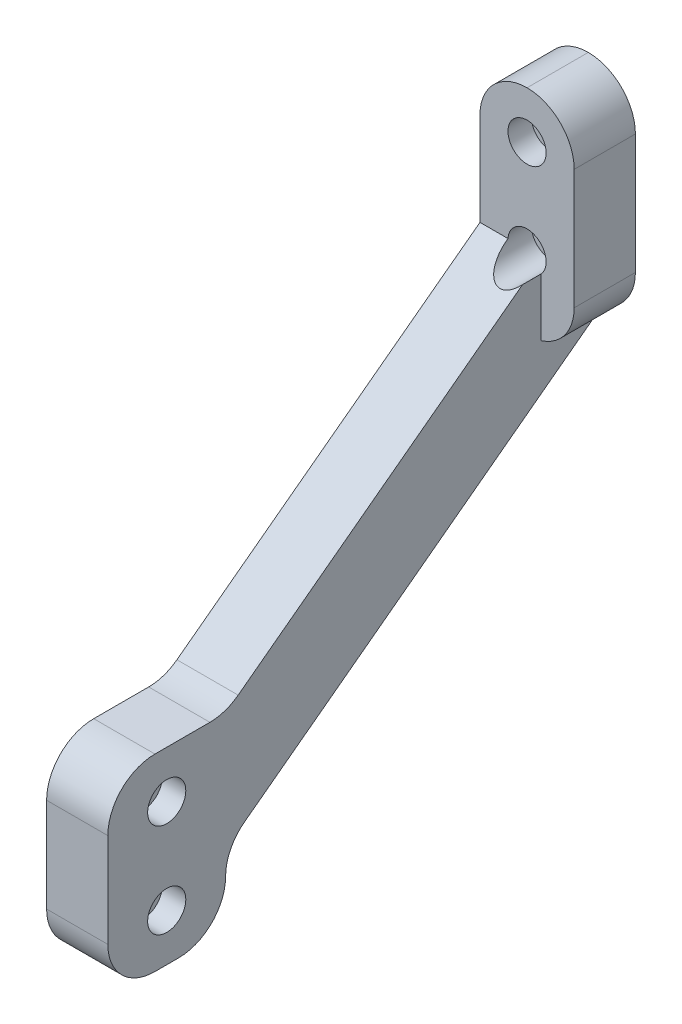
ISO-10303-21;
HEADER;
FILE_DESCRIPTION(('STEP AP214'),'2;1');
FILE_NAME('part.step','',(''),(''),'','','');
FILE_SCHEMA(('AUTOMOTIVE_DESIGN { 1 0 10303 214 1 1 1 1 }'));
ENDSEC;
DATA;
#1=APPLICATION_CONTEXT('core data for automotive mechanical design processes');
#2=APPLICATION_PROTOCOL_DEFINITION('international standard','automotive_design',2000,#1);
#3=PRODUCT_CONTEXT('',#1,'mechanical');
#4=PRODUCT('Part','Part','',(#3));
#5=PRODUCT_RELATED_PRODUCT_CATEGORY('part','',(#4));
#6=PRODUCT_DEFINITION_FORMATION('','',#4);
#7=PRODUCT_DEFINITION_CONTEXT('part definition',#1,'design');
#8=PRODUCT_DEFINITION('design','',#6,#7);
#9=PRODUCT_DEFINITION_SHAPE('','',#8);
#10=(LENGTH_UNIT() NAMED_UNIT(*) SI_UNIT(.MILLI.,.METRE.));
#11=(NAMED_UNIT(*) PLANE_ANGLE_UNIT() SI_UNIT($,.RADIAN.));
#12=(NAMED_UNIT(*) SI_UNIT($,.STERADIAN.) SOLID_ANGLE_UNIT());
#13=UNCERTAINTY_MEASURE_WITH_UNIT(LENGTH_MEASURE(1.E-05),#10,'distance_accuracy_value','');
#14=(GEOMETRIC_REPRESENTATION_CONTEXT(3) GLOBAL_UNCERTAINTY_ASSIGNED_CONTEXT((#13)) GLOBAL_UNIT_ASSIGNED_CONTEXT((#10,
#11,#12)) REPRESENTATION_CONTEXT('',''));
#15=CARTESIAN_POINT('',(0.,0.,0.));
#16=DIRECTION('',(0.,0.,1.));
#17=DIRECTION('',(1.,0.,0.));
#18=AXIS2_PLACEMENT_3D('',#15,#16,#17);
#19=CARTESIAN_POINT('',(0.,10.,-12.5));
#20=DIRECTION('',(1.,0.,0.));
#21=DIRECTION('',(0.,0.,-1.));
#22=AXIS2_PLACEMENT_3D('',#19,#20,#21);
#23=CYLINDRICAL_SURFACE('',#22,2.125);
#24=CARTESIAN_POINT('',(0.,10.,-12.5));
#25=DIRECTION('',(1.,0.,0.));
#26=DIRECTION('',(0.,0.,-1.));
#27=AXIS2_PLACEMENT_3D('',#24,#25,#26);
#28=CIRCLE('',#27,2.125);
#29=CARTESIAN_POINT('',(0.,10.,-14.625));
#30=VERTEX_POINT('',#29);
#31=EDGE_CURVE('E244',#30,#30,#28,.T.);
#32=CARTESIAN_POINT('',(8.,10.,-12.5));
#33=DIRECTION('',(1.,0.,0.));
#34=DIRECTION('',(0.,0.,-1.));
#35=AXIS2_PLACEMENT_3D('',#32,#33,#34);
#36=CIRCLE('',#35,2.125);
#37=CARTESIAN_POINT('',(8.,10.,-14.625));
#38=VERTEX_POINT('',#37);
#39=EDGE_CURVE('E239',#38,#38,#36,.F.);
#40=CARTESIAN_POINT('',(0.,10.,-14.625));
#41=CARTESIAN_POINT('',(0.0833333333333335,10.,-14.625));
#42=CARTESIAN_POINT('',(0.166666666666667,10.,-14.625));
#43=CARTESIAN_POINT('',(0.333333333333333,10.,-14.625));
#44=CARTESIAN_POINT('',(0.416666666666667,10.,-14.625));
#45=CARTESIAN_POINT('',(0.583333333333333,10.,-14.625));
#46=CARTESIAN_POINT('',(0.666666666666667,10.,-14.625));
#47=CARTESIAN_POINT('',(0.833333333333333,10.,-14.625));
#48=CARTESIAN_POINT('',(0.916666666666667,10.,-14.625));
#49=CARTESIAN_POINT('',(1.08333333333333,10.,-14.625));
#50=CARTESIAN_POINT('',(1.16666666666667,10.,-14.625));
#51=CARTESIAN_POINT('',(1.33333333333333,10.,-14.625));
#52=CARTESIAN_POINT('',(1.41666666666667,10.,-14.625));
#53=CARTESIAN_POINT('',(1.58333333333333,10.,-14.625));
#54=CARTESIAN_POINT('',(1.66666666666667,10.,-14.625));
#55=CARTESIAN_POINT('',(1.83333333333333,10.,-14.625));
#56=CARTESIAN_POINT('',(1.91666666666667,10.,-14.625));
#57=CARTESIAN_POINT('',(2.08333333333333,10.,-14.625));
#58=CARTESIAN_POINT('',(2.16666666666667,10.,-14.625));
#59=CARTESIAN_POINT('',(2.33333333333333,10.,-14.625));
#60=CARTESIAN_POINT('',(2.41666666666667,10.,-14.625));
#61=CARTESIAN_POINT('',(2.58333333333333,10.,-14.625));
#62=CARTESIAN_POINT('',(2.66666666666667,10.,-14.625));
#63=CARTESIAN_POINT('',(2.83333333333333,10.,-14.625));
#64=CARTESIAN_POINT('',(2.91666666666667,10.,-14.625));
#65=CARTESIAN_POINT('',(3.08333333333333,10.,-14.625));
#66=CARTESIAN_POINT('',(3.16666666666667,10.,-14.625));
#67=CARTESIAN_POINT('',(3.33333333333333,10.,-14.625));
#68=CARTESIAN_POINT('',(3.41666666666667,10.,-14.625));
#69=CARTESIAN_POINT('',(3.58333333333333,10.,-14.625));
#70=CARTESIAN_POINT('',(3.66666666666667,10.,-14.625));
#71=CARTESIAN_POINT('',(3.83333333333333,10.,-14.625));
#72=CARTESIAN_POINT('',(3.91666666666667,10.,-14.625));
#73=CARTESIAN_POINT('',(4.08333333333333,10.,-14.625));
#74=CARTESIAN_POINT('',(4.16666666666667,10.,-14.625));
#75=CARTESIAN_POINT('',(4.33333333333333,10.,-14.625));
#76=CARTESIAN_POINT('',(4.41666666666667,10.,-14.625));
#77=CARTESIAN_POINT('',(4.58333333333333,10.,-14.625));
#78=CARTESIAN_POINT('',(4.66666666666667,10.,-14.625));
#79=CARTESIAN_POINT('',(4.83333333333333,10.,-14.625));
#80=CARTESIAN_POINT('',(4.91666666666667,10.,-14.625));
#81=CARTESIAN_POINT('',(5.08333333333333,10.,-14.625));
#82=CARTESIAN_POINT('',(5.16666666666667,10.,-14.625));
#83=CARTESIAN_POINT('',(5.33333333333333,10.,-14.625));
#84=CARTESIAN_POINT('',(5.41666666666667,10.,-14.625));
#85=CARTESIAN_POINT('',(5.58333333333333,10.,-14.625));
#86=CARTESIAN_POINT('',(5.66666666666667,10.,-14.625));
#87=CARTESIAN_POINT('',(5.83333333333333,10.,-14.625));
#88=CARTESIAN_POINT('',(5.91666666666667,10.,-14.625));
#89=CARTESIAN_POINT('',(6.08333333333333,10.,-14.625));
#90=CARTESIAN_POINT('',(6.16666666666667,10.,-14.625));
#91=CARTESIAN_POINT('',(6.33333333333333,10.,-14.625));
#92=CARTESIAN_POINT('',(6.41666666666667,10.,-14.625));
#93=CARTESIAN_POINT('',(6.58333333333333,10.,-14.625));
#94=CARTESIAN_POINT('',(6.66666666666667,10.,-14.625));
#95=CARTESIAN_POINT('',(6.83333333333333,10.,-14.625));
#96=CARTESIAN_POINT('',(6.91666666666667,10.,-14.625));
#97=CARTESIAN_POINT('',(7.08333333333333,10.,-14.625));
#98=CARTESIAN_POINT('',(7.16666666666667,10.,-14.625));
#99=CARTESIAN_POINT('',(7.33333333333333,10.,-14.625));
#100=CARTESIAN_POINT('',(7.41666666666667,10.,-14.625));
#101=CARTESIAN_POINT('',(7.58333333333333,10.,-14.625));
#102=CARTESIAN_POINT('',(7.66666666666667,10.,-14.625));
#103=CARTESIAN_POINT('',(7.83333333333333,10.,-14.625));
#104=CARTESIAN_POINT('',(7.91666666666667,10.,-14.625));
#105=CARTESIAN_POINT('',(8.,10.,-14.625));
#106=B_SPLINE_CURVE_WITH_KNOTS('',3,(#40,#41,#42,#43,#44,#45,#46,#47,#48,#49,#50,#51,#52,#53,
#54,#55,#56,#57,#58,#59,#60,#61,#62,#63,#64,#65,#66,#67,#68,#69,#70,#71,#72,#73,#74,#75,#76,#77,
#78,#79,#80,#81,#82,#83,#84,#85,#86,#87,#88,#89,#90,#91,#92,#93,#94,#95,#96,#97,#98,#99,#100,
#101,#102,#103,#104,#105),.UNSPECIFIED.,.F.,.F.,(4,2,2,2,2,2,2,2,2,2,2,2,2,2,2,2,2,2,2,2,2,2,2,
2,2,2,2,2,2,2,2,2,4),(0.,0.25,0.5,0.75,1.,1.25,1.5,1.75,2.,2.25,2.5,2.75,3.,3.25,3.5,3.75,4.,
4.25,4.5,4.75,5.,5.25,5.5,5.75,6.,6.25,6.5,6.75,7.,7.25,7.5,7.75,8.),.UNSPECIFIED.);
#107=EDGE_CURVE('BSEAM41',#30,#38,#106,.T.);
#108=ORIENTED_EDGE('',*,*,#31,.F.);
#109=ORIENTED_EDGE('',*,*,#39,.F.);
#110=ORIENTED_EDGE('',*,*,#107,.T.);
#111=ORIENTED_EDGE('',*,*,#107,.F.);
#112=EDGE_LOOP('',(#108,#110,#109,#111));
#113=FACE_BOUND('',#112,.T.);
#114=ADVANCED_FACE('F41',(#113),#23,.F.);
#115=CARTESIAN_POINT('',(0.,30.,-12.5));
#116=DIRECTION('',(1.,0.,0.));
#117=DIRECTION('',(0.,0.,-1.));
#118=AXIS2_PLACEMENT_3D('',#115,#116,#117);
#119=CYLINDRICAL_SURFACE('',#118,2.125);
#120=CARTESIAN_POINT('',(0.,30.,-12.5));
#121=DIRECTION('',(1.,0.,0.));
#122=DIRECTION('',(0.,0.,-1.));
#123=AXIS2_PLACEMENT_3D('',#120,#121,#122);
#124=CIRCLE('',#123,2.125);
#125=CARTESIAN_POINT('',(0.,30.,-14.625));
#126=VERTEX_POINT('',#125);
#127=EDGE_CURVE('E368',#126,#126,#124,.T.);
#128=CARTESIAN_POINT('',(8.,30.,-12.5));
#129=DIRECTION('',(1.,0.,0.));
#130=DIRECTION('',(0.,0.,-1.));
#131=AXIS2_PLACEMENT_3D('',#128,#129,#130);
#132=CIRCLE('',#131,2.125);
#133=CARTESIAN_POINT('',(8.,30.,-14.625));
#134=VERTEX_POINT('',#133);
#135=EDGE_CURVE('E235',#134,#134,#132,.F.);
#136=CARTESIAN_POINT('',(0.,30.,-14.625));
#137=CARTESIAN_POINT('',(0.0833333333333335,30.,-14.625));
#138=CARTESIAN_POINT('',(0.166666666666667,30.,-14.625));
#139=CARTESIAN_POINT('',(0.333333333333333,30.,-14.625));
#140=CARTESIAN_POINT('',(0.416666666666667,30.,-14.625));
#141=CARTESIAN_POINT('',(0.583333333333333,30.,-14.625));
#142=CARTESIAN_POINT('',(0.666666666666667,30.,-14.625));
#143=CARTESIAN_POINT('',(0.833333333333333,30.,-14.625));
#144=CARTESIAN_POINT('',(0.916666666666667,30.,-14.625));
#145=CARTESIAN_POINT('',(1.08333333333333,30.,-14.625));
#146=CARTESIAN_POINT('',(1.16666666666667,30.,-14.625));
#147=CARTESIAN_POINT('',(1.33333333333333,30.,-14.625));
#148=CARTESIAN_POINT('',(1.41666666666667,30.,-14.625));
#149=CARTESIAN_POINT('',(1.58333333333333,30.,-14.625));
#150=CARTESIAN_POINT('',(1.66666666666667,30.,-14.625));
#151=CARTESIAN_POINT('',(1.83333333333333,30.,-14.625));
#152=CARTESIAN_POINT('',(1.91666666666667,30.,-14.625));
#153=CARTESIAN_POINT('',(2.08333333333333,30.,-14.625));
#154=CARTESIAN_POINT('',(2.16666666666667,30.,-14.625));
#155=CARTESIAN_POINT('',(2.33333333333333,30.,-14.625));
#156=CARTESIAN_POINT('',(2.41666666666667,30.,-14.625));
#157=CARTESIAN_POINT('',(2.58333333333333,30.,-14.625));
#158=CARTESIAN_POINT('',(2.66666666666667,30.,-14.625));
#159=CARTESIAN_POINT('',(2.83333333333333,30.,-14.625));
#160=CARTESIAN_POINT('',(2.91666666666667,30.,-14.625));
#161=CARTESIAN_POINT('',(3.08333333333333,30.,-14.625));
#162=CARTESIAN_POINT('',(3.16666666666667,30.,-14.625));
#163=CARTESIAN_POINT('',(3.33333333333333,30.,-14.625));
#164=CARTESIAN_POINT('',(3.41666666666667,30.,-14.625));
#165=CARTESIAN_POINT('',(3.58333333333333,30.,-14.625));
#166=CARTESIAN_POINT('',(3.66666666666667,30.,-14.625));
#167=CARTESIAN_POINT('',(3.83333333333333,30.,-14.625));
#168=CARTESIAN_POINT('',(3.91666666666667,30.,-14.625));
#169=CARTESIAN_POINT('',(4.08333333333333,30.,-14.625));
#170=CARTESIAN_POINT('',(4.16666666666667,30.,-14.625));
#171=CARTESIAN_POINT('',(4.33333333333333,30.,-14.625));
#172=CARTESIAN_POINT('',(4.41666666666667,30.,-14.625));
#173=CARTESIAN_POINT('',(4.58333333333333,30.,-14.625));
#174=CARTESIAN_POINT('',(4.66666666666667,30.,-14.625));
#175=CARTESIAN_POINT('',(4.83333333333333,30.,-14.625));
#176=CARTESIAN_POINT('',(4.91666666666667,30.,-14.625));
#177=CARTESIAN_POINT('',(5.08333333333333,30.,-14.625));
#178=CARTESIAN_POINT('',(5.16666666666667,30.,-14.625));
#179=CARTESIAN_POINT('',(5.33333333333333,30.,-14.625));
#180=CARTESIAN_POINT('',(5.41666666666667,30.,-14.625));
#181=CARTESIAN_POINT('',(5.58333333333333,30.,-14.625));
#182=CARTESIAN_POINT('',(5.66666666666667,30.,-14.625));
#183=CARTESIAN_POINT('',(5.83333333333333,30.,-14.625));
#184=CARTESIAN_POINT('',(5.91666666666667,30.,-14.625));
#185=CARTESIAN_POINT('',(6.08333333333333,30.,-14.625));
#186=CARTESIAN_POINT('',(6.16666666666667,30.,-14.625));
#187=CARTESIAN_POINT('',(6.33333333333333,30.,-14.625));
#188=CARTESIAN_POINT('',(6.41666666666667,30.,-14.625));
#189=CARTESIAN_POINT('',(6.58333333333333,30.,-14.625));
#190=CARTESIAN_POINT('',(6.66666666666667,30.,-14.625));
#191=CARTESIAN_POINT('',(6.83333333333333,30.,-14.625));
#192=CARTESIAN_POINT('',(6.91666666666667,30.,-14.625));
#193=CARTESIAN_POINT('',(7.08333333333333,30.,-14.625));
#194=CARTESIAN_POINT('',(7.16666666666667,30.,-14.625));
#195=CARTESIAN_POINT('',(7.33333333333333,30.,-14.625));
#196=CARTESIAN_POINT('',(7.41666666666667,30.,-14.625));
#197=CARTESIAN_POINT('',(7.58333333333333,30.,-14.625));
#198=CARTESIAN_POINT('',(7.66666666666667,30.,-14.625));
#199=CARTESIAN_POINT('',(7.83333333333333,30.,-14.625));
#200=CARTESIAN_POINT('',(7.91666666666667,30.,-14.625));
#201=CARTESIAN_POINT('',(8.,30.,-14.625));
#202=B_SPLINE_CURVE_WITH_KNOTS('',3,(#136,#137,#138,#139,#140,#141,#142,#143,#144,#145,#146,
#147,#148,#149,#150,#151,#152,#153,#154,#155,#156,#157,#158,#159,#160,#161,#162,#163,#164,#165,
#166,#167,#168,#169,#170,#171,#172,#173,#174,#175,#176,#177,#178,#179,#180,#181,#182,#183,#184,
#185,#186,#187,#188,#189,#190,#191,#192,#193,#194,#195,#196,#197,#198,#199,#200,#201),
.UNSPECIFIED.,.F.,.F.,(4,2,2,2,2,2,2,2,2,2,2,2,2,2,2,2,2,2,2,2,2,2,2,2,2,2,2,2,2,2,2,2,4),(0.,
0.25,0.5,0.75,1.,1.25,1.5,1.75,2.,2.25,2.5,2.75,3.,3.25,3.5,3.75,4.,4.25,4.5,4.75,5.,5.25,5.5,
5.75,6.,6.25,6.5,6.75,7.,7.25,7.5,7.75,8.),.UNSPECIFIED.);
#203=EDGE_CURVE('BSEAM444',#126,#134,#202,.T.);
#204=ORIENTED_EDGE('',*,*,#127,.F.);
#205=ORIENTED_EDGE('',*,*,#135,.F.);
#206=ORIENTED_EDGE('',*,*,#203,.T.);
#207=ORIENTED_EDGE('',*,*,#203,.F.);
#208=EDGE_LOOP('',(#204,#206,#205,#207));
#209=FACE_BOUND('',#208,.T.);
#210=ADVANCED_FACE('F444',(#209),#119,.F.);
#211=CARTESIAN_POINT('',(13.,0.,0.));
#212=DIRECTION('',(-1.,0.,0.));
#213=DIRECTION('',(0.,0.,1.));
#214=AXIS2_PLACEMENT_3D('',#211,#212,#213);
#215=PLANE('',#214);
#216=CARTESIAN_POINT('',(13.,30.,-12.5));
#217=DIRECTION('',(1.,0.,0.));
#218=DIRECTION('',(0.,0.,-1.));
#219=AXIS2_PLACEMENT_3D('',#216,#217,#218);
#220=CIRCLE('',#219,4.05);
#221=CARTESIAN_POINT('',(13.,30.,-16.55));
#222=VERTEX_POINT('',#221);
#223=EDGE_CURVE('E392',#222,#222,#220,.T.);
#224=ORIENTED_EDGE('',*,*,#223,.F.);
#225=EDGE_LOOP('',(#224));
#226=FACE_BOUND('',#225,.T.);
#227=CARTESIAN_POINT('',(13.,10.,-12.5));
#228=DIRECTION('',(1.,0.,0.));
#229=DIRECTION('',(0.,0.,-1.));
#230=AXIS2_PLACEMENT_3D('',#227,#228,#229);
#231=CIRCLE('',#230,4.05);
#232=CARTESIAN_POINT('',(13.,10.,-16.55));
#233=VERTEX_POINT('',#232);
#234=EDGE_CURVE('E383',#233,#233,#231,.T.);
#235=ORIENTED_EDGE('',*,*,#234,.F.);
#236=EDGE_LOOP('',(#235));
#237=FACE_BOUND('',#236,.T.);
#238=DIRECTION('',(0.,-1.,0.));
#239=VECTOR('',#238,1.);
#240=CARTESIAN_POINT('',(13.,0.,0.));
#241=LINE('',#240,#239);
#242=CARTESIAN_POINT('',(13.,30.,0.));
#243=VERTEX_POINT('',#242);
#244=CARTESIAN_POINT('',(13.,10.,0.));
#245=VERTEX_POINT('',#244);
#246=EDGE_CURVE('E194',#243,#245,#241,.T.);
#247=ORIENTED_EDGE('',*,*,#246,.T.);
#248=CARTESIAN_POINT('',(13.,10.,-10.));
#249=DIRECTION('',(-1.,0.,0.));
#250=DIRECTION('',(0.,0.,1.));
#251=AXIS2_PLACEMENT_3D('',#248,#249,#250);
#252=CIRCLE('',#251,10.);
#253=CARTESIAN_POINT('',(13.,0.,-10.));
#254=VERTEX_POINT('',#253);
#255=EDGE_CURVE('E293',#245,#254,#252,.F.);
#256=ORIENTED_EDGE('',*,*,#255,.T.);
#257=DIRECTION('',(0.,0.,-1.));
#258=VECTOR('',#257,1.);
#259=CARTESIAN_POINT('',(13.,0.,-25.));
#260=LINE('',#259,#258);
#261=CARTESIAN_POINT('',(13.,0.,-15.));
#262=VERTEX_POINT('',#261);
#263=EDGE_CURVE('E197',#254,#262,#260,.T.);
#264=ORIENTED_EDGE('',*,*,#263,.T.);
#265=CARTESIAN_POINT('',(13.,10.,-15.));
#266=DIRECTION('',(-1.,0.,0.));
#267=DIRECTION('',(0.,0.,1.));
#268=AXIS2_PLACEMENT_3D('',#265,#266,#267);
#269=CIRCLE('',#268,10.);
#270=CARTESIAN_POINT('',(13.,10.,-25.));
#271=VERTEX_POINT('',#270);
#272=EDGE_CURVE('E290',#262,#271,#269,.F.);
#273=ORIENTED_EDGE('',*,*,#272,.T.);
#274=CARTESIAN_POINT('',(13.,10.,-35.));
#275=DIRECTION('',(-1.,0.,0.));
#276=DIRECTION('',(0.,0.,1.));
#277=AXIS2_PLACEMENT_3D('',#274,#275,#276);
#278=CIRCLE('',#277,10.);
#279=CARTESIAN_POINT('',(13.,18.,-29.));
#280=VERTEX_POINT('',#279);
#281=EDGE_CURVE('E257',#271,#280,#278,.T.);
#282=ORIENTED_EDGE('',*,*,#281,.T.);
#283=DIRECTION('',(0.,0.6,-0.8));
#284=VECTOR('',#283,1.);
#285=CARTESIAN_POINT('',(13.,75.,-105.));
#286=LINE('',#285,#284);
#287=CARTESIAN_POINT('',(13.,75.,-105.));
#288=VERTEX_POINT('',#287);
#289=EDGE_CURVE('E189',#280,#288,#286,.T.);
#290=ORIENTED_EDGE('',*,*,#289,.T.);
#291=DIRECTION('',(0.,0.,-1.));
#292=VECTOR('',#291,1.);
#293=CARTESIAN_POINT('',(13.,75.,-105.));
#294=LINE('',#293,#292);
#295=CARTESIAN_POINT('',(13.,75.,-92.0000000000001));
#296=VERTEX_POINT('',#295);
#297=EDGE_CURVE('E363',#296,#288,#294,.T.);
#298=ORIENTED_EDGE('',*,*,#297,.F.);
#299=DIRECTION('',(0.,-1.,0.));
#300=VECTOR('',#299,1.);
#301=CARTESIAN_POINT('',(13.,120.,-92.0000000000001));
#302=LINE('',#301,#300);
#303=CARTESIAN_POINT('',(13.,87.2792464279174,-92.0000000000001));
#304=VERTEX_POINT('',#303);
#305=EDGE_CURVE('E179',#304,#296,#302,.T.);
#306=ORIENTED_EDGE('',*,*,#305,.F.);
#307=DIRECTION('',(0.,0.,-1.));
#308=VECTOR('',#307,1.);
#309=CARTESIAN_POINT('',(13.,87.2792464279174,0.00100000000004169));
#310=LINE('',#309,#308);
#311=CARTESIAN_POINT('',(13.,87.2792464279174,-88.0389952372233));
#312=VERTEX_POINT('',#311);
#313=EDGE_CURVE('E161',#312,#304,#310,.T.);
#314=ORIENTED_EDGE('',*,*,#313,.F.);
#315=DIRECTION('',(0.,-0.599999999999999,0.8));
#316=VECTOR('',#315,1.);
#317=CARTESIAN_POINT('',(13.,40.,-25.));
#318=LINE('',#317,#316);
#319=CARTESIAN_POINT('',(13.,42.,-27.6666666666667));
#320=VERTEX_POINT('',#319);
#321=EDGE_CURVE('E176',#312,#320,#318,.T.);
#322=ORIENTED_EDGE('',*,*,#321,.T.);
#323=CARTESIAN_POINT('',(13.,50.,-21.6666666666667));
#324=DIRECTION('',(-1.,0.,0.));
#325=DIRECTION('',(0.,0.,1.));
#326=AXIS2_PLACEMENT_3D('',#323,#324,#325);
#327=CIRCLE('',#326,10.);
#328=CARTESIAN_POINT('',(13.,40.,-21.6666666666667));
#329=VERTEX_POINT('',#328);
#330=EDGE_CURVE('E11',#320,#329,#327,.T.);
#331=ORIENTED_EDGE('',*,*,#330,.T.);
#332=DIRECTION('',(0.,0.,1.));
#333=VECTOR('',#332,1.);
#334=CARTESIAN_POINT('',(13.,40.,0.));
#335=LINE('',#334,#333);
#336=CARTESIAN_POINT('',(13.,40.,-9.99999999999999));
#337=VERTEX_POINT('',#336);
#338=EDGE_CURVE('E188',#329,#337,#335,.T.);
#339=ORIENTED_EDGE('',*,*,#338,.T.);
#340=CARTESIAN_POINT('',(13.,30.,-10.));
#341=DIRECTION('',(-1.,0.,0.));
#342=DIRECTION('',(0.,0.,1.));
#343=AXIS2_PLACEMENT_3D('',#340,#341,#342);
#344=CIRCLE('',#343,10.);
#345=EDGE_CURVE('E287',#337,#243,#344,.F.);
#346=ORIENTED_EDGE('',*,*,#345,.T.);
#347=EDGE_LOOP('',(#247,#256,#264,#273,#282,#290,#298,#306,#314,#322,#331,#339,#346));
#348=FACE_BOUND('',#347,.T.);
#349=ADVANCED_FACE('F175',(#226,#237,#348),#215,.F.);
#350=CARTESIAN_POINT('',(13.,0.,-25.));
#351=DIRECTION('',(0.,1.,0.));
#352=DIRECTION('',(0.,0.,1.));
#353=AXIS2_PLACEMENT_3D('',#350,#351,#352);
#354=PLANE('',#353);
#355=ORIENTED_EDGE('',*,*,#263,.F.);
#356=DIRECTION('',(-1.,0.,0.));
#357=VECTOR('',#356,1.);
#358=CARTESIAN_POINT('',(13.,0.,-10.));
#359=LINE('',#358,#357);
#360=CARTESIAN_POINT('',(0.,0.,-10.));
#361=VERTEX_POINT('',#360);
#362=EDGE_CURVE('E263',#254,#361,#359,.T.);
#363=ORIENTED_EDGE('',*,*,#362,.T.);
#364=DIRECTION('',(0.,0.,-1.));
#365=VECTOR('',#364,1.);
#366=CARTESIAN_POINT('',(0.,0.,-25.));
#367=LINE('',#366,#365);
#368=CARTESIAN_POINT('',(0.,0.,-15.));
#369=VERTEX_POINT('',#368);
#370=EDGE_CURVE('E204',#361,#369,#367,.T.);
#371=ORIENTED_EDGE('',*,*,#370,.T.);
#372=DIRECTION('',(-1.,0.,0.));
#373=VECTOR('',#372,1.);
#374=CARTESIAN_POINT('',(13.,0.,-15.));
#375=LINE('',#374,#373);
#376=EDGE_CURVE('E260',#369,#262,#375,.F.);
#377=ORIENTED_EDGE('',*,*,#376,.T.);
#378=EDGE_LOOP('',(#355,#363,#371,#377));
#379=FACE_BOUND('',#378,.T.);
#380=ADVANCED_FACE('F359',(#379),#354,.F.);
#381=CARTESIAN_POINT('',(13.,75.,-105.));
#382=DIRECTION('',(0.,0.8,0.6));
#383=DIRECTION('',(0.,-0.6,0.8));
#384=AXIS2_PLACEMENT_3D('',#381,#382,#383);
#385=PLANE('',#384);
#386=ORIENTED_EDGE('',*,*,#289,.F.);
#387=DIRECTION('',(-1.,0.,0.));
#388=VECTOR('',#387,1.);
#389=CARTESIAN_POINT('',(0.,18.,-29.));
#390=LINE('',#389,#388);
#391=CARTESIAN_POINT('',(0.,18.,-29.));
#392=VERTEX_POINT('',#391);
#393=EDGE_CURVE('E245',#280,#392,#390,.T.);
#394=ORIENTED_EDGE('',*,*,#393,.T.);
#395=DIRECTION('',(0.,0.6,-0.8));
#396=VECTOR('',#395,1.);
#397=CARTESIAN_POINT('',(0.,75.,-105.));
#398=LINE('',#397,#396);
#399=CARTESIAN_POINT('',(0.,75.,-105.));
#400=VERTEX_POINT('',#399);
#401=EDGE_CURVE('E208',#392,#400,#398,.T.);
#402=ORIENTED_EDGE('',*,*,#401,.T.);
#403=DIRECTION('',(-1.,0.,0.));
#404=VECTOR('',#403,1.);
#405=CARTESIAN_POINT('',(13.,75.,-105.));
#406=LINE('',#405,#404);
#407=EDGE_CURVE('E231',#288,#400,#406,.T.);
#408=ORIENTED_EDGE('',*,*,#407,.F.);
#409=EDGE_LOOP('',(#386,#394,#402,#408));
#410=FACE_BOUND('',#409,.T.);
#411=ADVANCED_FACE('F480',(#410),#385,.F.);
#412=CARTESIAN_POINT('',(13.,120.,-105.));
#413=DIRECTION('',(0.,0.,1.));
#414=DIRECTION('',(0.,-1.,0.));
#415=AXIS2_PLACEMENT_3D('',#412,#413,#414);
#416=PLANE('',#415);
#417=CARTESIAN_POINT('',(10.,110.,-105.));
#418=DIRECTION('',(0.,0.,-1.));
#419=DIRECTION('',(0.,1.,0.));
#420=AXIS2_PLACEMENT_3D('',#417,#418,#419);
#421=CIRCLE('',#420,2.125);
#422=CARTESIAN_POINT('',(10.,112.125,-105.));
#423=VERTEX_POINT('',#422);
#424=EDGE_CURVE('E388',#423,#423,#421,.T.);
#425=ORIENTED_EDGE('',*,*,#424,.F.);
#426=EDGE_LOOP('',(#425));
#427=FACE_BOUND('',#426,.T.);
#428=CARTESIAN_POINT('',(10.,90.,-105.));
#429=DIRECTION('',(0.,0.,-1.));
#430=DIRECTION('',(0.,1.,0.));
#431=AXIS2_PLACEMENT_3D('',#428,#429,#430);
#432=CIRCLE('',#431,2.125);
#433=CARTESIAN_POINT('',(10.,92.125,-105.));
#434=VERTEX_POINT('',#433);
#435=EDGE_CURVE('E399',#434,#434,#432,.T.);
#436=ORIENTED_EDGE('',*,*,#435,.F.);
#437=EDGE_LOOP('',(#436));
#438=FACE_BOUND('',#437,.T.);
#439=DIRECTION('',(0.,1.,0.));
#440=VECTOR('',#439,1.);
#441=CARTESIAN_POINT('',(20.,120.,-105.));
#442=LINE('',#441,#440);
#443=CARTESIAN_POINT('',(20.,84.5393920141695,-105.));
#444=VERTEX_POINT('',#443);
#445=CARTESIAN_POINT('',(20.,110.,-105.));
#446=VERTEX_POINT('',#445);
#447=EDGE_CURVE('E367',#444,#446,#442,.T.);
#448=ORIENTED_EDGE('',*,*,#447,.F.);
#449=CARTESIAN_POINT('',(10.,84.5393920141695,-105.));
#450=DIRECTION('',(0.,0.,1.));
#451=DIRECTION('',(0.,-1.,0.));
#452=AXIS2_PLACEMENT_3D('',#449,#450,#451);
#453=CIRCLE('',#452,10.);
#454=EDGE_CURVE('E317',#444,#288,#453,.F.);
#455=ORIENTED_EDGE('',*,*,#454,.T.);
#456=ORIENTED_EDGE('',*,*,#407,.T.);
#457=DIRECTION('',(0.,1.,0.));
#458=VECTOR('',#457,1.);
#459=CARTESIAN_POINT('',(0.,120.,-105.));
#460=LINE('',#459,#458);
#461=CARTESIAN_POINT('',(0.,110.,-105.));
#462=VERTEX_POINT('',#461);
#463=EDGE_CURVE('E212',#400,#462,#460,.T.);
#464=ORIENTED_EDGE('',*,*,#463,.T.);
#465=CARTESIAN_POINT('',(10.,110.,-105.));
#466=DIRECTION('',(0.,0.,1.));
#467=DIRECTION('',(0.,-1.,0.));
#468=AXIS2_PLACEMENT_3D('',#465,#466,#467);
#469=CIRCLE('',#468,10.);
#470=CARTESIAN_POINT('',(10.,120.,-105.));
#471=VERTEX_POINT('',#470);
#472=EDGE_CURVE('E66',#462,#471,#469,.F.);
#473=ORIENTED_EDGE('',*,*,#472,.T.);
#474=CARTESIAN_POINT('',(10.,110.,-105.));
#475=DIRECTION('',(0.,0.,1.));
#476=DIRECTION('',(0.,-1.,0.));
#477=AXIS2_PLACEMENT_3D('',#474,#475,#476);
#478=CIRCLE('',#477,10.);
#479=EDGE_CURVE('E312',#471,#446,#478,.F.);
#480=ORIENTED_EDGE('',*,*,#479,.T.);
#481=EDGE_LOOP('',(#448,#455,#456,#464,#473,#480));
#482=FACE_BOUND('',#481,.T.);
#483=ADVANCED_FACE('F476',(#427,#438,#482),#416,.F.);
#484=CARTESIAN_POINT('',(13.,90.25,-92.0000000000001));
#485=DIRECTION('',(0.,0.,-1.));
#486=DIRECTION('',(-1.,0.,0.));
#487=AXIS2_PLACEMENT_3D('',#484,#485,#486);
#488=PLANE('',#487);
#489=CARTESIAN_POINT('',(10.,110.,-92.0000000000001));
#490=DIRECTION('',(0.,0.,-1.));
#491=DIRECTION('',(-1.,0.,0.));
#492=AXIS2_PLACEMENT_3D('',#489,#490,#491);
#493=CIRCLE('',#492,4.05);
#494=CARTESIAN_POINT('',(10.,114.05,-92.0000000000001));
#495=VERTEX_POINT('',#494);
#496=EDGE_CURVE('E403',#495,#495,#493,.F.);
#497=ORIENTED_EDGE('',*,*,#496,.F.);
#498=EDGE_LOOP('',(#497));
#499=FACE_BOUND('',#498,.T.);
#500=ORIENTED_EDGE('',*,*,#305,.T.);
#501=CARTESIAN_POINT('',(10.,84.5393920141695,-92.0000000000001));
#502=DIRECTION('',(0.,0.,-1.));
#503=DIRECTION('',(-1.,0.,0.));
#504=AXIS2_PLACEMENT_3D('',#501,#502,#503);
#505=CIRCLE('',#504,10.);
#506=CARTESIAN_POINT('',(20.,84.5393920141695,-92.0000000000001));
#507=VERTEX_POINT('',#506);
#508=EDGE_CURVE('E325',#296,#507,#505,.F.);
#509=ORIENTED_EDGE('',*,*,#508,.T.);
#510=DIRECTION('',(0.,-1.,0.));
#511=VECTOR('',#510,1.);
#512=CARTESIAN_POINT('',(20.,120.,-92.0000000000001));
#513=LINE('',#512,#511);
#514=CARTESIAN_POINT('',(20.,110.,-92.0000000000001));
#515=VERTEX_POINT('',#514);
#516=EDGE_CURVE('E209',#515,#507,#513,.T.);
#517=ORIENTED_EDGE('',*,*,#516,.F.);
#518=CARTESIAN_POINT('',(10.,110.,-92.0000000000001));
#519=DIRECTION('',(0.,0.,-1.));
#520=DIRECTION('',(-1.,0.,0.));
#521=AXIS2_PLACEMENT_3D('',#518,#519,#520);
#522=CIRCLE('',#521,10.);
#523=CARTESIAN_POINT('',(10.,120.,-92.0000000000001));
#524=VERTEX_POINT('',#523);
#525=EDGE_CURVE('E58',#515,#524,#522,.F.);
#526=ORIENTED_EDGE('',*,*,#525,.T.);
#527=CARTESIAN_POINT('',(10.,110.,-92.0000000000001));
#528=DIRECTION('',(0.,0.,-1.));
#529=DIRECTION('',(-1.,0.,0.));
#530=AXIS2_PLACEMENT_3D('',#527,#528,#529);
#531=CIRCLE('',#530,10.);
#532=CARTESIAN_POINT('',(0.,110.,-92.0000000000001));
#533=VERTEX_POINT('',#532);
#534=EDGE_CURVE('E322',#524,#533,#531,.F.);
#535=ORIENTED_EDGE('',*,*,#534,.T.);
#536=DIRECTION('',(0.,-1.,0.));
#537=VECTOR('',#536,1.);
#538=CARTESIAN_POINT('',(0.,90.25,-92.0000000000001));
#539=LINE('',#538,#537);
#540=CARTESIAN_POINT('',(0.,90.25,-92.0000000000001));
#541=VERTEX_POINT('',#540);
#542=EDGE_CURVE('E215',#533,#541,#539,.T.);
#543=ORIENTED_EDGE('',*,*,#542,.T.);
#544=DIRECTION('',(-1.,0.,0.));
#545=VECTOR('',#544,1.);
#546=CARTESIAN_POINT('',(13.,90.25,-92.0000000000001));
#547=LINE('',#546,#545);
#548=CARTESIAN_POINT('',(5.95772341371845,90.25,-92.0000000000001));
#549=VERTEX_POINT('',#548);
#550=EDGE_CURVE('E203',#549,#541,#547,.T.);
#551=ORIENTED_EDGE('',*,*,#550,.F.);
#552=CARTESIAN_POINT('',(10.,90.,-92.0000000000001));
#553=DIRECTION('',(0.,0.,-1.));
#554=DIRECTION('',(-1.,0.,0.));
#555=AXIS2_PLACEMENT_3D('',#552,#553,#554);
#556=CIRCLE('',#555,4.05);
#557=EDGE_CURVE('E163',#304,#549,#556,.F.);
#558=ORIENTED_EDGE('',*,*,#557,.F.);
#559=EDGE_LOOP('',(#500,#509,#517,#526,#535,#543,#551,#558));
#560=FACE_BOUND('',#559,.T.);
#561=ADVANCED_FACE('F473',(#499,#560),#488,.F.);
#562=CARTESIAN_POINT('',(13.,40.,-25.));
#563=DIRECTION('',(0.,-0.8,-0.599999999999999));
#564=DIRECTION('',(0.,0.599999999999999,-0.800000000000001));
#565=AXIS2_PLACEMENT_3D('',#562,#563,#564);
#566=PLANE('',#565);
#567=DIRECTION('',(0.,-0.599999999999999,0.8));
#568=VECTOR('',#567,1.);
#569=CARTESIAN_POINT('',(0.,40.,-25.));
#570=LINE('',#569,#568);
#571=CARTESIAN_POINT('',(0.,42.,-27.6666666666667));
#572=VERTEX_POINT('',#571);
#573=EDGE_CURVE('E218',#541,#572,#570,.T.);
#574=ORIENTED_EDGE('',*,*,#573,.T.);
#575=DIRECTION('',(-1.,0.,0.));
#576=VECTOR('',#575,1.);
#577=CARTESIAN_POINT('',(13.,42.,-27.6666666666667));
#578=LINE('',#577,#576);
#579=EDGE_CURVE('E186',#572,#320,#578,.F.);
#580=ORIENTED_EDGE('',*,*,#579,.T.);
#581=ORIENTED_EDGE('',*,*,#321,.F.);
#582=CARTESIAN_POINT('',(10.,90.,-91.6666666666668));
#583=DIRECTION('',(0.,-0.8,-0.599999999999999));
#584=DIRECTION('',(0.,0.599999999999999,-0.800000000000001));
#585=AXIS2_PLACEMENT_3D('',#582,#583,#584);
#586=ELLIPSE('',#585,6.75000000000001,4.05);
#587=EDGE_CURVE('E158',#549,#312,#586,.F.);
#588=ORIENTED_EDGE('',*,*,#587,.F.);
#589=ORIENTED_EDGE('',*,*,#550,.T.);
#590=EDGE_LOOP('',(#574,#580,#581,#588,#589));
#591=FACE_BOUND('',#590,.T.);
#592=ADVANCED_FACE('F184',(#591),#566,.F.);
#593=CARTESIAN_POINT('',(13.,40.,0.));
#594=DIRECTION('',(0.,-1.,0.));
#595=DIRECTION('',(0.,0.,-1.));
#596=AXIS2_PLACEMENT_3D('',#593,#594,#595);
#597=PLANE('',#596);
#598=ORIENTED_EDGE('',*,*,#338,.F.);
#599=DIRECTION('',(-1.,0.,0.));
#600=VECTOR('',#599,1.);
#601=CARTESIAN_POINT('',(0.,40.,-21.6666666666667));
#602=LINE('',#601,#600);
#603=CARTESIAN_POINT('',(0.,40.,-21.6666666666667));
#604=VERTEX_POINT('',#603);
#605=EDGE_CURVE('E299',#329,#604,#602,.T.);
#606=ORIENTED_EDGE('',*,*,#605,.T.);
#607=DIRECTION('',(0.,0.,1.));
#608=VECTOR('',#607,1.);
#609=CARTESIAN_POINT('',(0.,40.,0.));
#610=LINE('',#609,#608);
#611=CARTESIAN_POINT('',(0.,40.,-9.99999999999999));
#612=VERTEX_POINT('',#611);
#613=EDGE_CURVE('E221',#604,#612,#610,.T.);
#614=ORIENTED_EDGE('',*,*,#613,.T.);
#615=DIRECTION('',(-1.,0.,0.));
#616=VECTOR('',#615,1.);
#617=CARTESIAN_POINT('',(13.,40.,-9.99999999999999));
#618=LINE('',#617,#616);
#619=EDGE_CURVE('E296',#612,#337,#618,.F.);
#620=ORIENTED_EDGE('',*,*,#619,.T.);
#621=EDGE_LOOP('',(#598,#606,#614,#620));
#622=FACE_BOUND('',#621,.T.);
#623=ADVANCED_FACE('F341',(#622),#597,.F.);
#624=CARTESIAN_POINT('',(13.,0.,0.));
#625=DIRECTION('',(0.,0.,-1.));
#626=DIRECTION('',(-1.,0.,0.));
#627=AXIS2_PLACEMENT_3D('',#624,#625,#626);
#628=PLANE('',#627);
#629=DIRECTION('',(0.,-1.,0.));
#630=VECTOR('',#629,1.);
#631=CARTESIAN_POINT('',(0.,0.,0.));
#632=LINE('',#631,#630);
#633=CARTESIAN_POINT('',(0.,30.,0.));
#634=VERTEX_POINT('',#633);
#635=CARTESIAN_POINT('',(0.,10.,0.));
#636=VERTEX_POINT('',#635);
#637=EDGE_CURVE('E225',#634,#636,#632,.T.);
#638=ORIENTED_EDGE('',*,*,#637,.T.);
#639=DIRECTION('',(-1.,0.,0.));
#640=VECTOR('',#639,1.);
#641=CARTESIAN_POINT('',(13.,10.,0.));
#642=LINE('',#641,#640);
#643=EDGE_CURVE('E284',#636,#245,#642,.F.);
#644=ORIENTED_EDGE('',*,*,#643,.T.);
#645=ORIENTED_EDGE('',*,*,#246,.F.);
#646=DIRECTION('',(-1.,0.,0.));
#647=VECTOR('',#646,1.);
#648=CARTESIAN_POINT('',(13.,30.,0.));
#649=LINE('',#648,#647);
#650=EDGE_CURVE('E280',#243,#634,#649,.T.);
#651=ORIENTED_EDGE('',*,*,#650,.T.);
#652=EDGE_LOOP('',(#638,#644,#645,#651));
#653=FACE_BOUND('',#652,.T.);
#654=ADVANCED_FACE('F349',(#653),#628,.F.);
#655=CARTESIAN_POINT('',(0.,0.,0.));
#656=DIRECTION('',(-1.,0.,0.));
#657=DIRECTION('',(0.,0.,1.));
#658=AXIS2_PLACEMENT_3D('',#655,#656,#657);
#659=PLANE('',#658);
#660=ORIENTED_EDGE('',*,*,#127,.T.);
#661=EDGE_LOOP('',(#660));
#662=FACE_BOUND('',#661,.T.);
#663=ORIENTED_EDGE('',*,*,#31,.T.);
#664=EDGE_LOOP('',(#663));
#665=FACE_BOUND('',#664,.T.);
#666=ORIENTED_EDGE('',*,*,#370,.F.);
#667=CARTESIAN_POINT('',(0.,10.,-10.));
#668=DIRECTION('',(-1.,0.,0.));
#669=DIRECTION('',(0.,0.,1.));
#670=AXIS2_PLACEMENT_3D('',#667,#668,#669);
#671=CIRCLE('',#670,10.);
#672=EDGE_CURVE('E277',#361,#636,#671,.T.);
#673=ORIENTED_EDGE('',*,*,#672,.T.);
#674=ORIENTED_EDGE('',*,*,#637,.F.);
#675=CARTESIAN_POINT('',(0.,30.,-10.));
#676=DIRECTION('',(-1.,0.,0.));
#677=DIRECTION('',(0.,0.,1.));
#678=AXIS2_PLACEMENT_3D('',#675,#676,#677);
#679=CIRCLE('',#678,10.);
#680=EDGE_CURVE('E271',#634,#612,#679,.T.);
#681=ORIENTED_EDGE('',*,*,#680,.T.);
#682=ORIENTED_EDGE('',*,*,#613,.F.);
#683=CARTESIAN_POINT('',(0.,50.,-21.6666666666667));
#684=DIRECTION('',(-1.,0.,0.));
#685=DIRECTION('',(0.,0.,1.));
#686=AXIS2_PLACEMENT_3D('',#683,#684,#685);
#687=CIRCLE('',#686,10.);
#688=EDGE_CURVE('E51',#604,#572,#687,.F.);
#689=ORIENTED_EDGE('',*,*,#688,.T.);
#690=ORIENTED_EDGE('',*,*,#573,.F.);
#691=ORIENTED_EDGE('',*,*,#542,.F.);
#692=DIRECTION('',(0.,0.,1.));
#693=VECTOR('',#692,1.);
#694=CARTESIAN_POINT('',(0.,110.,-105.));
#695=LINE('',#694,#693);
#696=EDGE_CURVE('E267',#533,#462,#695,.F.);
#697=ORIENTED_EDGE('',*,*,#696,.T.);
#698=ORIENTED_EDGE('',*,*,#463,.F.);
#699=ORIENTED_EDGE('',*,*,#401,.F.);
#700=CARTESIAN_POINT('',(0.,10.,-35.));
#701=DIRECTION('',(-1.,0.,0.));
#702=DIRECTION('',(0.,0.,1.));
#703=AXIS2_PLACEMENT_3D('',#700,#701,#702);
#704=CIRCLE('',#703,10.);
#705=CARTESIAN_POINT('',(0.,10.,-25.));
#706=VERTEX_POINT('',#705);
#707=EDGE_CURVE('E253',#392,#706,#704,.F.);
#708=ORIENTED_EDGE('',*,*,#707,.T.);
#709=CARTESIAN_POINT('',(0.,10.,-15.));
#710=DIRECTION('',(-1.,0.,0.));
#711=DIRECTION('',(0.,0.,1.));
#712=AXIS2_PLACEMENT_3D('',#709,#710,#711);
#713=CIRCLE('',#712,10.);
#714=EDGE_CURVE('E274',#706,#369,#713,.T.);
#715=ORIENTED_EDGE('',*,*,#714,.T.);
#716=EDGE_LOOP('',(#666,#673,#674,#681,#682,#689,#690,#691,#697,#698,#699,#708,#715));
#717=FACE_BOUND('',#716,.T.);
#718=ADVANCED_FACE('F333',(#662,#665,#717),#659,.T.);
#719=CARTESIAN_POINT('',(20.,0.,0.));
#720=DIRECTION('',(-1.,0.,0.));
#721=DIRECTION('',(0.,0.,1.));
#722=AXIS2_PLACEMENT_3D('',#719,#720,#721);
#723=PLANE('',#722);
#724=ORIENTED_EDGE('',*,*,#516,.T.);
#725=DIRECTION('',(0.,0.,1.));
#726=VECTOR('',#725,1.);
#727=CARTESIAN_POINT('',(20.,84.5393920141695,0.));
#728=LINE('',#727,#726);
#729=EDGE_CURVE('E308',#507,#444,#728,.F.);
#730=ORIENTED_EDGE('',*,*,#729,.T.);
#731=ORIENTED_EDGE('',*,*,#447,.T.);
#732=DIRECTION('',(0.,0.,1.));
#733=VECTOR('',#732,1.);
#734=CARTESIAN_POINT('',(20.,110.,0.));
#735=LINE('',#734,#733);
#736=EDGE_CURVE('E305',#446,#515,#735,.T.);
#737=ORIENTED_EDGE('',*,*,#736,.T.);
#738=EDGE_LOOP('',(#724,#730,#731,#737));
#739=FACE_BOUND('',#738,.T.);
#740=ADVANCED_FACE('F456',(#739),#723,.F.);
#741=CARTESIAN_POINT('',(8.,30.,-12.5));
#742=DIRECTION('',(1.,0.,0.));
#743=DIRECTION('',(0.,0.,-1.));
#744=AXIS2_PLACEMENT_3D('',#741,#742,#743);
#745=PLANE('',#744);
#746=CARTESIAN_POINT('',(8.,30.,-12.5));
#747=DIRECTION('',(1.,0.,0.));
#748=DIRECTION('',(0.,0.,-1.));
#749=AXIS2_PLACEMENT_3D('',#746,#747,#748);
#750=CIRCLE('',#749,4.05);
#751=CARTESIAN_POINT('',(8.,30.,-16.55));
#752=VERTEX_POINT('',#751);
#753=EDGE_CURVE('E240',#752,#752,#750,.T.);
#754=ORIENTED_EDGE('',*,*,#753,.T.);
#755=EDGE_LOOP('',(#754));
#756=FACE_BOUND('',#755,.T.);
#757=ORIENTED_EDGE('',*,*,#135,.T.);
#758=EDGE_LOOP('',(#757));
#759=FACE_BOUND('',#758,.T.);
#760=ADVANCED_FACE('F459',(#756,#759),#745,.T.);
#761=CARTESIAN_POINT('',(8.,30.,-12.5));
#762=DIRECTION('',(1.,0.,0.));
#763=DIRECTION('',(0.,0.,-1.));
#764=AXIS2_PLACEMENT_3D('',#761,#762,#763);
#765=CYLINDRICAL_SURFACE('',#764,4.05);
#766=ORIENTED_EDGE('',*,*,#753,.F.);
#767=EDGE_LOOP('',(#766));
#768=FACE_BOUND('',#767,.T.);
#769=ORIENTED_EDGE('',*,*,#223,.T.);
#770=EDGE_LOOP('',(#769));
#771=FACE_BOUND('',#770,.T.);
#772=ADVANCED_FACE('F613',(#768,#771),#765,.F.);
#773=CARTESIAN_POINT('',(8.,10.,-12.5));
#774=DIRECTION('',(1.,0.,0.));
#775=DIRECTION('',(0.,0.,-1.));
#776=AXIS2_PLACEMENT_3D('',#773,#774,#775);
#777=PLANE('',#776);
#778=CARTESIAN_POINT('',(8.,10.,-12.5));
#779=DIRECTION('',(1.,0.,0.));
#780=DIRECTION('',(0.,0.,-1.));
#781=AXIS2_PLACEMENT_3D('',#778,#779,#780);
#782=CIRCLE('',#781,4.05);
#783=CARTESIAN_POINT('',(8.,10.,-16.55));
#784=VERTEX_POINT('',#783);
#785=EDGE_CURVE('E387',#784,#784,#782,.T.);
#786=ORIENTED_EDGE('',*,*,#785,.T.);
#787=EDGE_LOOP('',(#786));
#788=FACE_BOUND('',#787,.T.);
#789=ORIENTED_EDGE('',*,*,#39,.T.);
#790=EDGE_LOOP('',(#789));
#791=FACE_BOUND('',#790,.T.);
#792=ADVANCED_FACE('F604',(#788,#791),#777,.T.);
#793=CARTESIAN_POINT('',(8.,10.,-12.5));
#794=DIRECTION('',(1.,0.,0.));
#795=DIRECTION('',(0.,0.,-1.));
#796=AXIS2_PLACEMENT_3D('',#793,#794,#795);
#797=CYLINDRICAL_SURFACE('',#796,4.05);
#798=ORIENTED_EDGE('',*,*,#785,.F.);
#799=EDGE_LOOP('',(#798));
#800=FACE_BOUND('',#799,.T.);
#801=ORIENTED_EDGE('',*,*,#234,.T.);
#802=EDGE_LOOP('',(#801));
#803=FACE_BOUND('',#802,.T.);
#804=ADVANCED_FACE('F594',(#800,#803),#797,.F.);
#805=CARTESIAN_POINT('',(10.,90.,0.00100000000002876));
#806=DIRECTION('',(0.,0.,-1.));
#807=DIRECTION('',(0.,1.,0.));
#808=AXIS2_PLACEMENT_3D('',#805,#806,#807);
#809=CYLINDRICAL_SURFACE('',#808,2.125);
#810=CARTESIAN_POINT('',(10.,90.,-97.0000000000001));
#811=DIRECTION('',(0.,0.,-1.));
#812=DIRECTION('',(0.,1.,0.));
#813=AXIS2_PLACEMENT_3D('',#810,#811,#812);
#814=CIRCLE('',#813,2.125);
#815=CARTESIAN_POINT('',(10.,92.125,-97.0000000000001));
#816=VERTEX_POINT('',#815);
#817=EDGE_CURVE('E169',#816,#816,#814,.T.);
#818=ORIENTED_EDGE('',*,*,#817,.F.);
#819=EDGE_LOOP('',(#818));
#820=FACE_BOUND('',#819,.T.);
#821=ORIENTED_EDGE('',*,*,#435,.T.);
#822=EDGE_LOOP('',(#821));
#823=FACE_BOUND('',#822,.T.);
#824=ADVANCED_FACE('F584',(#820,#823),#809,.F.);
#825=CARTESIAN_POINT('',(10.,110.,0.00100000000004263));
#826=DIRECTION('',(0.,0.,-1.));
#827=DIRECTION('',(0.,1.,0.));
#828=AXIS2_PLACEMENT_3D('',#825,#826,#827);
#829=CYLINDRICAL_SURFACE('',#828,2.125);
#830=CARTESIAN_POINT('',(10.,110.,-97.0000000000001));
#831=DIRECTION('',(0.,0.,-1.));
#832=DIRECTION('',(0.,1.,0.));
#833=AXIS2_PLACEMENT_3D('',#830,#831,#832);
#834=CIRCLE('',#833,2.125);
#835=CARTESIAN_POINT('',(10.,112.125,-97.0000000000001));
#836=VERTEX_POINT('',#835);
#837=EDGE_CURVE('E419',#836,#836,#834,.T.);
#838=ORIENTED_EDGE('',*,*,#837,.F.);
#839=EDGE_LOOP('',(#838));
#840=FACE_BOUND('',#839,.T.);
#841=ORIENTED_EDGE('',*,*,#424,.T.);
#842=EDGE_LOOP('',(#841));
#843=FACE_BOUND('',#842,.T.);
#844=ADVANCED_FACE('F441',(#840,#843),#829,.F.);
#845=CARTESIAN_POINT('',(10.,110.,0.00100000000004263));
#846=DIRECTION('',(0.,0.,-1.));
#847=DIRECTION('',(0.,1.,0.));
#848=AXIS2_PLACEMENT_3D('',#845,#846,#847);
#849=CYLINDRICAL_SURFACE('',#848,4.05);
#850=CARTESIAN_POINT('',(10.,110.,-97.0000000000001));
#851=DIRECTION('',(0.,0.,-1.));
#852=DIRECTION('',(0.,1.,0.));
#853=AXIS2_PLACEMENT_3D('',#850,#851,#852);
#854=CIRCLE('',#853,4.05);
#855=CARTESIAN_POINT('',(10.,114.05,-97.0000000000001));
#856=VERTEX_POINT('',#855);
#857=EDGE_CURVE('E181',#856,#856,#854,.T.);
#858=CARTESIAN_POINT('',(10.,114.05,-97.0000000000001));
#859=CARTESIAN_POINT('',(10.,114.05,-96.9479166666668));
#860=CARTESIAN_POINT('',(10.,114.05,-96.8958333333334));
#861=CARTESIAN_POINT('',(10.,114.05,-96.7916666666667));
#862=CARTESIAN_POINT('',(10.,114.05,-96.7395833333334));
#863=CARTESIAN_POINT('',(10.,114.05,-96.6354166666668));
#864=CARTESIAN_POINT('',(10.,114.05,-96.5833333333334));
#865=CARTESIAN_POINT('',(10.,114.05,-96.4791666666668));
#866=CARTESIAN_POINT('',(10.,114.05,-96.4270833333334));
#867=CARTESIAN_POINT('',(10.,114.05,-96.3229166666667));
#868=CARTESIAN_POINT('',(10.,114.05,-96.2708333333334));
#869=CARTESIAN_POINT('',(10.,114.05,-96.1666666666667));
#870=CARTESIAN_POINT('',(10.,114.05,-96.1145833333334));
#871=CARTESIAN_POINT('',(10.,114.05,-96.0104166666668));
#872=CARTESIAN_POINT('',(10.,114.05,-95.9583333333334));
#873=CARTESIAN_POINT('',(10.,114.05,-95.8541666666668));
#874=CARTESIAN_POINT('',(10.,114.05,-95.8020833333334));
#875=CARTESIAN_POINT('',(10.,114.05,-95.6979166666667));
#876=CARTESIAN_POINT('',(10.,114.05,-95.6458333333334));
#877=CARTESIAN_POINT('',(10.,114.05,-95.5416666666667));
#878=CARTESIAN_POINT('',(10.,114.05,-95.4895833333334));
#879=CARTESIAN_POINT('',(10.,114.05,-95.3854166666668));
#880=CARTESIAN_POINT('',(10.,114.05,-95.3333333333334));
#881=CARTESIAN_POINT('',(10.,114.05,-95.2291666666667));
#882=CARTESIAN_POINT('',(10.,114.05,-95.1770833333334));
#883=CARTESIAN_POINT('',(10.,114.05,-95.0729166666667));
#884=CARTESIAN_POINT('',(10.,114.05,-95.0208333333334));
#885=CARTESIAN_POINT('',(10.,114.05,-94.9166666666667));
#886=CARTESIAN_POINT('',(10.,114.05,-94.8645833333334));
#887=CARTESIAN_POINT('',(10.,114.05,-94.7604166666667));
#888=CARTESIAN_POINT('',(10.,114.05,-94.7083333333334));
#889=CARTESIAN_POINT('',(10.,114.05,-94.6041666666667));
#890=CARTESIAN_POINT('',(10.,114.05,-94.5520833333334));
#891=CARTESIAN_POINT('',(10.,114.05,-94.4479166666667));
#892=CARTESIAN_POINT('',(10.,114.05,-94.3958333333334));
#893=CARTESIAN_POINT('',(10.,114.05,-94.2916666666667));
#894=CARTESIAN_POINT('',(10.,114.05,-94.2395833333334));
#895=CARTESIAN_POINT('',(10.,114.05,-94.1354166666667));
#896=CARTESIAN_POINT('',(10.,114.05,-94.0833333333334));
#897=CARTESIAN_POINT('',(10.,114.05,-93.9791666666667));
#898=CARTESIAN_POINT('',(10.,114.05,-93.9270833333334));
#899=CARTESIAN_POINT('',(10.,114.05,-93.8229166666667));
#900=CARTESIAN_POINT('',(10.,114.05,-93.7708333333334));
#901=CARTESIAN_POINT('',(10.,114.05,-93.6666666666667));
#902=CARTESIAN_POINT('',(10.,114.05,-93.6145833333334));
#903=CARTESIAN_POINT('',(10.,114.05,-93.5104166666667));
#904=CARTESIAN_POINT('',(10.,114.05,-93.4583333333334));
#905=CARTESIAN_POINT('',(10.,114.05,-93.3541666666667));
#906=CARTESIAN_POINT('',(10.,114.05,-93.3020833333334));
#907=CARTESIAN_POINT('',(10.,114.05,-93.1979166666667));
#908=CARTESIAN_POINT('',(10.,114.05,-93.1458333333334));
#909=CARTESIAN_POINT('',(10.,114.05,-93.0416666666667));
#910=CARTESIAN_POINT('',(10.,114.05,-92.9895833333334));
#911=CARTESIAN_POINT('',(10.,114.05,-92.8854166666667));
#912=CARTESIAN_POINT('',(10.,114.05,-92.8333333333334));
#913=CARTESIAN_POINT('',(10.,114.05,-92.7291666666667));
#914=CARTESIAN_POINT('',(10.,114.05,-92.6770833333334));
#915=CARTESIAN_POINT('',(10.,114.05,-92.5729166666667));
#916=CARTESIAN_POINT('',(10.,114.05,-92.5208333333334));
#917=CARTESIAN_POINT('',(10.,114.05,-92.4166666666667));
#918=CARTESIAN_POINT('',(10.,114.05,-92.3645833333334));
#919=CARTESIAN_POINT('',(10.,114.05,-92.2604166666667));
#920=CARTESIAN_POINT('',(10.,114.05,-92.2083333333334));
#921=CARTESIAN_POINT('',(10.,114.05,-92.1041666666667));
#922=CARTESIAN_POINT('',(10.,114.05,-92.0520833333334));
#923=CARTESIAN_POINT('',(10.,114.05,-92.0000000000001));
#924=B_SPLINE_CURVE_WITH_KNOTS('',3,(#858,#859,#860,#861,#862,#863,#864,#865,#866,#867,#868,
#869,#870,#871,#872,#873,#874,#875,#876,#877,#878,#879,#880,#881,#882,#883,#884,#885,#886,#887,
#888,#889,#890,#891,#892,#893,#894,#895,#896,#897,#898,#899,#900,#901,#902,#903,#904,#905,#906,
#907,#908,#909,#910,#911,#912,#913,#914,#915,#916,#917,#918,#919,#920,#921,#922,#923),
.UNSPECIFIED.,.F.,.F.,(4,2,2,2,2,2,2,2,2,2,2,2,2,2,2,2,2,2,2,2,2,2,2,2,2,2,2,2,2,2,2,2,4),(0.,
0.156249999999997,0.312500000000007,0.468750000000004,0.625000000000001,0.781250000000011,
0.937500000000008,1.09375,1.25,1.40625000000001,1.56250000000001,1.71875,1.87500000000002,
2.03125000000001,2.18750000000001,2.34375000000002,2.50000000000002,2.65625000000001,
2.81250000000002,2.96875000000002,3.12500000000002,3.28125000000003,3.43750000000002,
3.59375000000002,3.75000000000003,3.90625000000003,4.06250000000002,4.21875000000002,
4.37500000000003,4.53125000000003,4.68750000000002,4.84375000000004,5.00000000000003),.UNSPECIFIED.);
#925=EDGE_CURVE('BSEAM427',#856,#495,#924,.T.);
#926=ORIENTED_EDGE('',*,*,#857,.T.);
#927=ORIENTED_EDGE('',*,*,#496,.T.);
#928=ORIENTED_EDGE('',*,*,#925,.T.);
#929=ORIENTED_EDGE('',*,*,#925,.F.);
#930=EDGE_LOOP('',(#926,#928,#927,#929));
#931=FACE_BOUND('',#930,.T.);
#932=ADVANCED_FACE('F427',(#931),#849,.F.);
#933=CARTESIAN_POINT('',(10.,110.,-97.0000000000001));
#934=DIRECTION('',(0.,0.,-1.));
#935=DIRECTION('',(0.,1.,0.));
#936=AXIS2_PLACEMENT_3D('',#933,#934,#935);
#937=PLANE('',#936);
#938=ORIENTED_EDGE('',*,*,#837,.T.);
#939=EDGE_LOOP('',(#938));
#940=FACE_BOUND('',#939,.T.);
#941=ORIENTED_EDGE('',*,*,#857,.F.);
#942=EDGE_LOOP('',(#941));
#943=FACE_BOUND('',#942,.T.);
#944=ADVANCED_FACE('F430',(#940,#943),#937,.F.);
#945=CARTESIAN_POINT('',(10.,90.,0.00100000000004263));
#946=DIRECTION('',(0.,0.,-1.));
#947=DIRECTION('',(0.,1.,0.));
#948=AXIS2_PLACEMENT_3D('',#945,#946,#947);
#949=CYLINDRICAL_SURFACE('',#948,4.05);
#950=CARTESIAN_POINT('',(10.,90.,-97.0000000000001));
#951=DIRECTION('',(0.,0.,-1.));
#952=DIRECTION('',(0.,1.,0.));
#953=AXIS2_PLACEMENT_3D('',#950,#951,#952);
#954=CIRCLE('',#953,4.05);
#955=CARTESIAN_POINT('',(10.,94.05,-97.0000000000001));
#956=VERTEX_POINT('',#955);
#957=EDGE_CURVE('E412',#956,#956,#954,.T.);
#958=ORIENTED_EDGE('',*,*,#957,.T.);
#959=EDGE_LOOP('',(#958));
#960=FACE_BOUND('',#959,.T.);
#961=ORIENTED_EDGE('',*,*,#313,.T.);
#962=ORIENTED_EDGE('',*,*,#557,.T.);
#963=ORIENTED_EDGE('',*,*,#587,.T.);
#964=EDGE_LOOP('',(#961,#962,#963));
#965=FACE_BOUND('',#964,.T.);
#966=ADVANCED_FACE('F160',(#960,#965),#949,.F.);
#967=CARTESIAN_POINT('',(10.,90.,-97.0000000000001));
#968=DIRECTION('',(0.,0.,-1.));
#969=DIRECTION('',(0.,1.,0.));
#970=AXIS2_PLACEMENT_3D('',#967,#968,#969);
#971=PLANE('',#970);
#972=ORIENTED_EDGE('',*,*,#817,.T.);
#973=EDGE_LOOP('',(#972));
#974=FACE_BOUND('',#973,.T.);
#975=ORIENTED_EDGE('',*,*,#957,.F.);
#976=EDGE_LOOP('',(#975));
#977=FACE_BOUND('',#976,.T.);
#978=ADVANCED_FACE('F438',(#974,#977),#971,.F.);
#979=CARTESIAN_POINT('',(13.,10.,-35.));
#980=DIRECTION('',(1.,0.,0.));
#981=DIRECTION('',(0.,0.,-1.));
#982=AXIS2_PLACEMENT_3D('',#979,#980,#981);
#983=CYLINDRICAL_SURFACE('',#982,10.);
#984=ORIENTED_EDGE('',*,*,#281,.F.);
#985=DIRECTION('',(-1.,0.,0.));
#986=VECTOR('',#985,1.);
#987=CARTESIAN_POINT('',(13.,10.,-25.));
#988=LINE('',#987,#986);
#989=EDGE_CURVE('E249',#706,#271,#988,.F.);
#990=ORIENTED_EDGE('',*,*,#989,.F.);
#991=ORIENTED_EDGE('',*,*,#707,.F.);
#992=ORIENTED_EDGE('',*,*,#393,.F.);
#993=EDGE_LOOP('',(#984,#990,#991,#992));
#994=FACE_BOUND('',#993,.T.);
#995=ADVANCED_FACE('F487',(#994),#983,.F.);
#996=CARTESIAN_POINT('',(13.,10.,-10.));
#997=DIRECTION('',(-1.,0.,0.));
#998=DIRECTION('',(0.,0.,1.));
#999=AXIS2_PLACEMENT_3D('',#996,#997,#998);
#1000=CYLINDRICAL_SURFACE('',#999,10.);
#1001=ORIENTED_EDGE('',*,*,#255,.F.);
#1002=ORIENTED_EDGE('',*,*,#643,.F.);
#1003=ORIENTED_EDGE('',*,*,#672,.F.);
#1004=ORIENTED_EDGE('',*,*,#362,.F.);
#1005=EDGE_LOOP('',(#1001,#1002,#1003,#1004));
#1006=FACE_BOUND('',#1005,.T.);
#1007=ADVANCED_FACE('F353',(#1006),#1000,.T.);
#1008=CARTESIAN_POINT('',(13.,10.,-15.));
#1009=DIRECTION('',(-1.,0.,0.));
#1010=DIRECTION('',(0.,0.,1.));
#1011=AXIS2_PLACEMENT_3D('',#1008,#1009,#1010);
#1012=CYLINDRICAL_SURFACE('',#1011,10.);
#1013=ORIENTED_EDGE('',*,*,#272,.F.);
#1014=ORIENTED_EDGE('',*,*,#376,.F.);
#1015=ORIENTED_EDGE('',*,*,#714,.F.);
#1016=ORIENTED_EDGE('',*,*,#989,.T.);
#1017=EDGE_LOOP('',(#1013,#1014,#1015,#1016));
#1018=FACE_BOUND('',#1017,.T.);
#1019=ADVANCED_FACE('F493',(#1018),#1012,.T.);
#1020=CARTESIAN_POINT('',(13.,50.,-21.6666666666667));
#1021=DIRECTION('',(1.,0.,0.));
#1022=DIRECTION('',(0.,0.,-1.));
#1023=AXIS2_PLACEMENT_3D('',#1020,#1021,#1022);
#1024=CYLINDRICAL_SURFACE('',#1023,10.);
#1025=ORIENTED_EDGE('',*,*,#330,.F.);
#1026=ORIENTED_EDGE('',*,*,#579,.F.);
#1027=ORIENTED_EDGE('',*,*,#688,.F.);
#1028=ORIENTED_EDGE('',*,*,#605,.F.);
#1029=EDGE_LOOP('',(#1025,#1026,#1027,#1028));
#1030=FACE_BOUND('',#1029,.T.);
#1031=ADVANCED_FACE('F337',(#1030),#1024,.F.);
#1032=CARTESIAN_POINT('',(13.,30.,-10.));
#1033=DIRECTION('',(-1.,0.,0.));
#1034=DIRECTION('',(0.,0.,1.));
#1035=AXIS2_PLACEMENT_3D('',#1032,#1033,#1034);
#1036=CYLINDRICAL_SURFACE('',#1035,10.);
#1037=ORIENTED_EDGE('',*,*,#345,.F.);
#1038=ORIENTED_EDGE('',*,*,#619,.F.);
#1039=ORIENTED_EDGE('',*,*,#680,.F.);
#1040=ORIENTED_EDGE('',*,*,#650,.F.);
#1041=EDGE_LOOP('',(#1037,#1038,#1039,#1040));
#1042=FACE_BOUND('',#1041,.T.);
#1043=ADVANCED_FACE('F344',(#1042),#1036,.T.);
#1044=CARTESIAN_POINT('',(10.,84.5393920141695,-105.));
#1045=DIRECTION('',(0.,0.,1.));
#1046=DIRECTION('',(1.,0.,0.));
#1047=AXIS2_PLACEMENT_3D('',#1044,#1045,#1046);
#1048=CYLINDRICAL_SURFACE('',#1047,10.);
#1049=ORIENTED_EDGE('',*,*,#508,.F.);
#1050=ORIENTED_EDGE('',*,*,#297,.T.);
#1051=ORIENTED_EDGE('',*,*,#454,.F.);
#1052=ORIENTED_EDGE('',*,*,#729,.F.);
#1053=EDGE_LOOP('',(#1049,#1050,#1051,#1052));
#1054=FACE_BOUND('',#1053,.T.);
#1055=ADVANCED_FACE('F501',(#1054),#1048,.T.);
#1056=CARTESIAN_POINT('',(10.,110.,0.));
#1057=DIRECTION('',(0.,0.,1.));
#1058=DIRECTION('',(1.,0.,0.));
#1059=AXIS2_PLACEMENT_3D('',#1056,#1057,#1058);
#1060=CYLINDRICAL_SURFACE('',#1059,10.);
#1061=ORIENTED_EDGE('',*,*,#736,.F.);
#1062=ORIENTED_EDGE('',*,*,#479,.F.);
#1063=DIRECTION('',(0.,0.,1.));
#1064=VECTOR('',#1063,1.);
#1065=CARTESIAN_POINT('',(10.,120.,-92.0000000000001));
#1066=LINE('',#1065,#1064);
#1067=EDGE_CURVE('E45',#524,#471,#1066,.F.);
#1068=ORIENTED_EDGE('',*,*,#1067,.F.);
#1069=ORIENTED_EDGE('',*,*,#525,.F.);
#1070=EDGE_LOOP('',(#1061,#1062,#1068,#1069));
#1071=FACE_BOUND('',#1070,.T.);
#1072=ADVANCED_FACE('F43',(#1071),#1060,.T.);
#1073=CARTESIAN_POINT('',(10.,110.,-92.0000000000001));
#1074=DIRECTION('',(0.,0.,-1.));
#1075=DIRECTION('',(-1.,0.,0.));
#1076=AXIS2_PLACEMENT_3D('',#1073,#1074,#1075);
#1077=CYLINDRICAL_SURFACE('',#1076,10.);
#1078=ORIENTED_EDGE('',*,*,#472,.F.);
#1079=ORIENTED_EDGE('',*,*,#696,.F.);
#1080=ORIENTED_EDGE('',*,*,#534,.F.);
#1081=ORIENTED_EDGE('',*,*,#1067,.T.);
#1082=EDGE_LOOP('',(#1078,#1079,#1080,#1081));
#1083=FACE_BOUND('',#1082,.T.);
#1084=ADVANCED_FACE('F504',(#1083),#1077,.T.);
#1085=CLOSED_SHELL('',(#114,#210,#349,#380,#411,#483,#561,#592,#623,#654,#718,#740,#760,#772,
#792,#804,#824,#844,#932,#944,#966,#978,#995,#1007,#1019,#1031,#1043,#1055,#1072,#1084));
#1086=MANIFOLD_SOLID_BREP('B2',#1085);
#1087=ADVANCED_BREP_SHAPE_REPRESENTATION('',(#18,#1086),#14);
#1088=SHAPE_DEFINITION_REPRESENTATION(#9,#1087);
ENDSEC;
END-ISO-10303-21;
